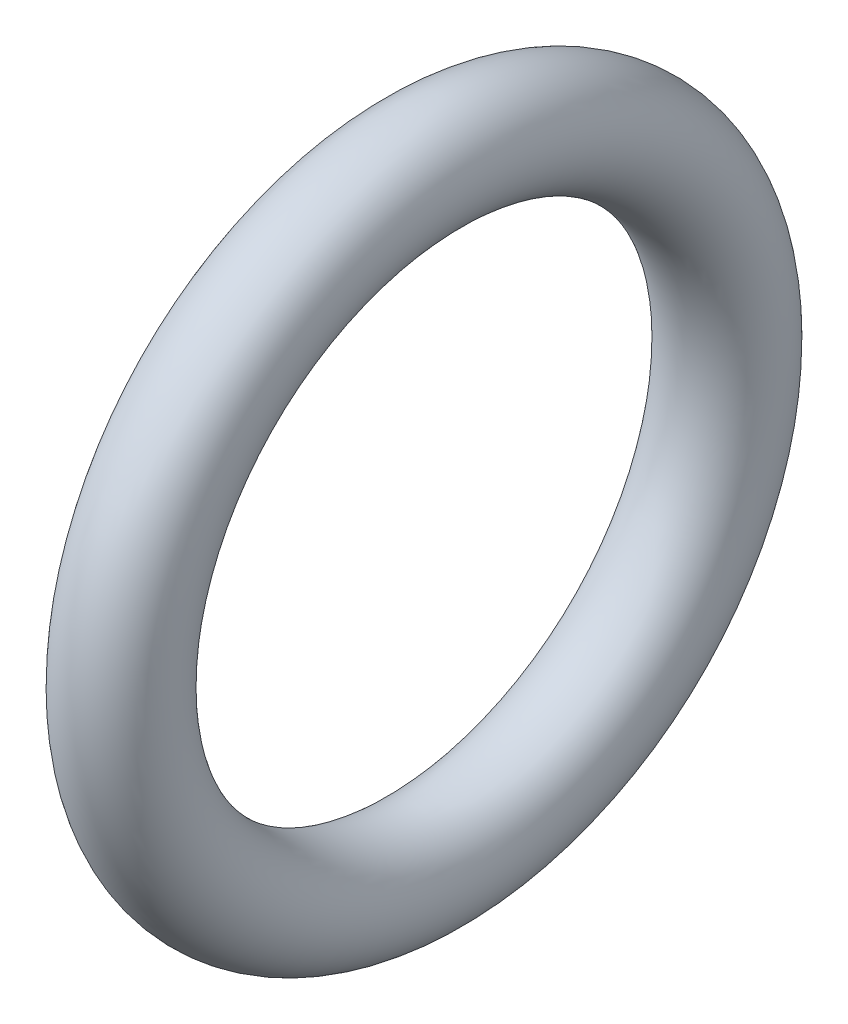
ISO-10303-21;
HEADER;
FILE_DESCRIPTION(('STEP AP214'),'2;1');
FILE_NAME('part.step','',(''),(''),'','','');
FILE_SCHEMA(('AUTOMOTIVE_DESIGN { 1 0 10303 214 1 1 1 1 }'));
ENDSEC;
DATA;
#1=APPLICATION_CONTEXT('core data for automotive mechanical design processes');
#2=APPLICATION_PROTOCOL_DEFINITION('international standard','automotive_design',2000,#1);
#3=PRODUCT_CONTEXT('',#1,'mechanical');
#4=PRODUCT('Part','Part','',(#3));
#5=PRODUCT_RELATED_PRODUCT_CATEGORY('part','',(#4));
#6=PRODUCT_DEFINITION_FORMATION('','',#4);
#7=PRODUCT_DEFINITION_CONTEXT('part definition',#1,'design');
#8=PRODUCT_DEFINITION('design','',#6,#7);
#9=PRODUCT_DEFINITION_SHAPE('','',#8);
#10=(LENGTH_UNIT() NAMED_UNIT(*) SI_UNIT(.MILLI.,.METRE.));
#11=(NAMED_UNIT(*) PLANE_ANGLE_UNIT() SI_UNIT($,.RADIAN.));
#12=(NAMED_UNIT(*) SI_UNIT($,.STERADIAN.) SOLID_ANGLE_UNIT());
#13=UNCERTAINTY_MEASURE_WITH_UNIT(LENGTH_MEASURE(1.E-05),#10,'distance_accuracy_value','');
#14=(GEOMETRIC_REPRESENTATION_CONTEXT(3) GLOBAL_UNCERTAINTY_ASSIGNED_CONTEXT((#13)) GLOBAL_UNIT_ASSIGNED_CONTEXT((#10,
#11,#12)) REPRESENTATION_CONTEXT('',''));
#15=CARTESIAN_POINT('',(0.,0.,0.));
#16=DIRECTION('',(0.,0.,1.));
#17=DIRECTION('',(1.,0.,0.));
#18=AXIS2_PLACEMENT_3D('',#15,#16,#17);
#19=CARTESIAN_POINT('',(0.,0.,0.));
#20=DIRECTION('',(-1.,0.,0.));
#21=DIRECTION('',(0.,0.,1.));
#22=AXIS2_PLACEMENT_3D('',#19,#20,#21);
#23=TOROIDAL_SURFACE('',#22,5.425,0.95);
#24=CARTESIAN_POINT('',(0.,0.,6.375));
#25=VERTEX_POINT('',#24);
#26=VERTEX_LOOP('',#25);
#27=FACE_BOUND('',#26,.T.);
#28=ADVANCED_FACE('F30',(#27),#23,.T.);
#29=CLOSED_SHELL('',(#28));
#30=MANIFOLD_SOLID_BREP('B2',#29);
#31=ADVANCED_BREP_SHAPE_REPRESENTATION('',(#18,#30),#14);
#32=SHAPE_DEFINITION_REPRESENTATION(#9,#31);
ENDSEC;
END-ISO-10303-21;
